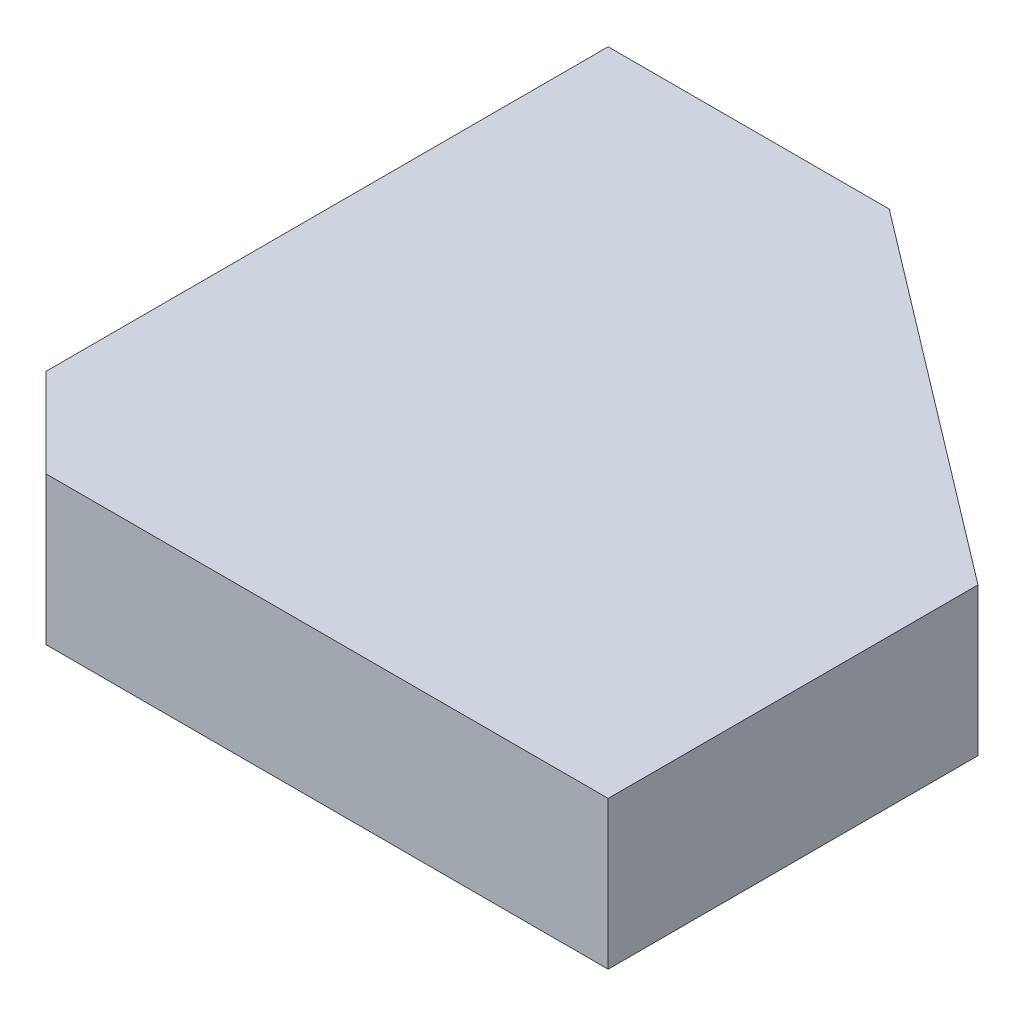
ISO-10303-21;
HEADER;
FILE_DESCRIPTION(('STEP AP214'),'2;1');
FILE_NAME('part.step','',(''),(''),'','','');
FILE_SCHEMA(('AUTOMOTIVE_DESIGN { 1 0 10303 214 1 1 1 1 }'));
ENDSEC;
DATA;
#1=APPLICATION_CONTEXT('core data for automotive mechanical design processes');
#2=APPLICATION_PROTOCOL_DEFINITION('international standard','automotive_design',2000,#1);
#3=PRODUCT_CONTEXT('',#1,'mechanical');
#4=PRODUCT('Part','Part','',(#3));
#5=PRODUCT_RELATED_PRODUCT_CATEGORY('part','',(#4));
#6=PRODUCT_DEFINITION_FORMATION('','',#4);
#7=PRODUCT_DEFINITION_CONTEXT('part definition',#1,'design');
#8=PRODUCT_DEFINITION('design','',#6,#7);
#9=PRODUCT_DEFINITION_SHAPE('','',#8);
#10=(LENGTH_UNIT() NAMED_UNIT(*) SI_UNIT(.MILLI.,.METRE.));
#11=(NAMED_UNIT(*) PLANE_ANGLE_UNIT() SI_UNIT($,.RADIAN.));
#12=(NAMED_UNIT(*) SI_UNIT($,.STERADIAN.) SOLID_ANGLE_UNIT());
#13=UNCERTAINTY_MEASURE_WITH_UNIT(LENGTH_MEASURE(1.E-05),#10,'distance_accuracy_value','');
#14=(GEOMETRIC_REPRESENTATION_CONTEXT(3) GLOBAL_UNCERTAINTY_ASSIGNED_CONTEXT((#13)) GLOBAL_UNIT_ASSIGNED_CONTEXT((#10,
#11,#12)) REPRESENTATION_CONTEXT('',''));
#15=CARTESIAN_POINT('',(0.,0.,0.));
#16=DIRECTION('',(0.,0.,1.));
#17=DIRECTION('',(1.,0.,0.));
#18=AXIS2_PLACEMENT_3D('',#15,#16,#17);
#19=CARTESIAN_POINT('',(0.,5.,0.));
#20=DIRECTION('',(-1.,0.,0.));
#21=DIRECTION('',(0.,0.,1.));
#22=AXIS2_PLACEMENT_3D('',#19,#20,#21);
#23=PLANE('',#22);
#24=DIRECTION('',(0.,0.,-1.));
#25=VECTOR('',#24,1.);
#26=CARTESIAN_POINT('',(0.,-5.,0.));
#27=LINE('',#26,#25);
#28=CARTESIAN_POINT('',(0.,-5.,-6.00000000000004));
#29=VERTEX_POINT('',#28);
#30=CARTESIAN_POINT('',(0.,-5.,-44.));
#31=VERTEX_POINT('',#30);
#32=EDGE_CURVE('E137',#29,#31,#27,.T.);
#33=ORIENTED_EDGE('',*,*,#32,.F.);
#34=DIRECTION('',(0.,1.,0.));
#35=VECTOR('',#34,1.);
#36=CARTESIAN_POINT('',(0.,5.,-6.00000000000004));
#37=LINE('',#36,#35);
#38=CARTESIAN_POINT('',(0.,5.,-6.00000000000003));
#39=VERTEX_POINT('',#38);
#40=EDGE_CURVE('E42',#29,#39,#37,.T.);
#41=ORIENTED_EDGE('',*,*,#40,.T.);
#42=DIRECTION('',(0.,0.,-1.));
#43=VECTOR('',#42,1.);
#44=CARTESIAN_POINT('',(0.,5.,0.));
#45=LINE('',#44,#43);
#46=CARTESIAN_POINT('',(0.,5.,-44.));
#47=VERTEX_POINT('',#46);
#48=EDGE_CURVE('E83',#39,#47,#45,.T.);
#49=ORIENTED_EDGE('',*,*,#48,.T.);
#50=DIRECTION('',(0.,-1.,0.));
#51=VECTOR('',#50,1.);
#52=CARTESIAN_POINT('',(0.,5.,-44.));
#53=LINE('',#52,#51);
#54=EDGE_CURVE('E86',#47,#31,#53,.T.);
#55=ORIENTED_EDGE('',*,*,#54,.T.);
#56=EDGE_LOOP('',(#33,#41,#49,#55));
#57=FACE_BOUND('',#56,.T.);
#58=ADVANCED_FACE('F34',(#57),#23,.T.);
#59=CARTESIAN_POINT('',(0.,5.,0.));
#60=DIRECTION('',(0.,0.,-1.));
#61=DIRECTION('',(-1.,0.,0.));
#62=AXIS2_PLACEMENT_3D('',#59,#60,#61);
#63=PLANE('',#62);
#64=DIRECTION('',(1.,0.,0.));
#65=VECTOR('',#64,1.);
#66=CARTESIAN_POINT('',(0.,5.,0.));
#67=LINE('',#66,#65);
#68=CARTESIAN_POINT('',(6.00000000000011,5.,0.));
#69=VERTEX_POINT('',#68);
#70=CARTESIAN_POINT('',(44.,5.,0.));
#71=VERTEX_POINT('',#70);
#72=EDGE_CURVE('E106',#69,#71,#67,.T.);
#73=ORIENTED_EDGE('',*,*,#72,.F.);
#74=DIRECTION('',(0.,-1.,0.));
#75=VECTOR('',#74,1.);
#76=CARTESIAN_POINT('',(6.0000000000001,-5.,0.));
#77=LINE('',#76,#75);
#78=CARTESIAN_POINT('',(6.0000000000001,-5.,0.));
#79=VERTEX_POINT('',#78);
#80=EDGE_CURVE('E114',#69,#79,#77,.T.);
#81=ORIENTED_EDGE('',*,*,#80,.T.);
#82=DIRECTION('',(1.,0.,0.));
#83=VECTOR('',#82,1.);
#84=CARTESIAN_POINT('',(0.,-5.,0.));
#85=LINE('',#84,#83);
#86=CARTESIAN_POINT('',(44.,-5.,0.));
#87=VERTEX_POINT('',#86);
#88=EDGE_CURVE('E92',#79,#87,#85,.T.);
#89=ORIENTED_EDGE('',*,*,#88,.T.);
#90=DIRECTION('',(0.,-1.,0.));
#91=VECTOR('',#90,1.);
#92=CARTESIAN_POINT('',(44.,5.,0.));
#93=LINE('',#92,#91);
#94=EDGE_CURVE('E117',#71,#87,#93,.T.);
#95=ORIENTED_EDGE('',*,*,#94,.F.);
#96=EDGE_LOOP('',(#73,#81,#89,#95));
#97=FACE_BOUND('',#96,.T.);
#98=ADVANCED_FACE('F145',(#97),#63,.F.);
#99=CARTESIAN_POINT('',(44.,5.,-25.));
#100=DIRECTION('',(1.,0.,0.));
#101=DIRECTION('',(0.,0.,-1.));
#102=AXIS2_PLACEMENT_3D('',#99,#100,#101);
#103=PLANE('',#102);
#104=DIRECTION('',(0.,0.,1.));
#105=VECTOR('',#104,1.);
#106=CARTESIAN_POINT('',(44.,-5.,-25.));
#107=LINE('',#106,#105);
#108=CARTESIAN_POINT('',(44.,-5.,-25.));
#109=VERTEX_POINT('',#108);
#110=EDGE_CURVE('E131',#109,#87,#107,.T.);
#111=ORIENTED_EDGE('',*,*,#110,.F.);
#112=DIRECTION('',(0.,-1.,0.));
#113=VECTOR('',#112,1.);
#114=CARTESIAN_POINT('',(44.,5.,-25.));
#115=LINE('',#114,#113);
#116=CARTESIAN_POINT('',(44.,5.,-25.));
#117=VERTEX_POINT('',#116);
#118=EDGE_CURVE('E108',#117,#109,#115,.T.);
#119=ORIENTED_EDGE('',*,*,#118,.F.);
#120=DIRECTION('',(0.,0.,1.));
#121=VECTOR('',#120,1.);
#122=CARTESIAN_POINT('',(44.,5.,-25.));
#123=LINE('',#122,#121);
#124=EDGE_CURVE('E110',#117,#71,#123,.T.);
#125=ORIENTED_EDGE('',*,*,#124,.T.);
#126=ORIENTED_EDGE('',*,*,#94,.T.);
#127=EDGE_LOOP('',(#111,#119,#125,#126));
#128=FACE_BOUND('',#127,.T.);
#129=ADVANCED_FACE('F146',(#128),#103,.T.);
#130=CARTESIAN_POINT('',(19.,5.,-44.));
#131=DIRECTION('',(0.605083267533558,0.,-0.796162194123103));
#132=DIRECTION('',(-0.796162194123103,0.,-0.605083267533558));
#133=AXIS2_PLACEMENT_3D('',#130,#131,#132);
#134=PLANE('',#133);
#135=DIRECTION('',(0.796162194123103,0.,0.605083267533558));
#136=VECTOR('',#135,1.);
#137=CARTESIAN_POINT('',(19.,-5.,-44.));
#138=LINE('',#137,#136);
#139=CARTESIAN_POINT('',(19.,-5.,-44.));
#140=VERTEX_POINT('',#139);
#141=EDGE_CURVE('E133',#140,#109,#138,.T.);
#142=ORIENTED_EDGE('',*,*,#141,.F.);
#143=DIRECTION('',(0.,-1.,0.));
#144=VECTOR('',#143,1.);
#145=CARTESIAN_POINT('',(19.,5.,-44.));
#146=LINE('',#145,#144);
#147=CARTESIAN_POINT('',(19.,5.,-44.));
#148=VERTEX_POINT('',#147);
#149=EDGE_CURVE('E105',#148,#140,#146,.T.);
#150=ORIENTED_EDGE('',*,*,#149,.F.);
#151=DIRECTION('',(0.796162194123103,0.,0.605083267533558));
#152=VECTOR('',#151,1.);
#153=CARTESIAN_POINT('',(19.,5.,-44.));
#154=LINE('',#153,#152);
#155=EDGE_CURVE('E99',#148,#117,#154,.T.);
#156=ORIENTED_EDGE('',*,*,#155,.T.);
#157=ORIENTED_EDGE('',*,*,#118,.T.);
#158=EDGE_LOOP('',(#142,#150,#156,#157));
#159=FACE_BOUND('',#158,.T.);
#160=ADVANCED_FACE('F142',(#159),#134,.T.);
#161=CARTESIAN_POINT('',(19.,5.,-44.));
#162=DIRECTION('',(0.,0.,1.));
#163=DIRECTION('',(1.,0.,0.));
#164=AXIS2_PLACEMENT_3D('',#161,#162,#163);
#165=PLANE('',#164);
#166=DIRECTION('',(-1.,0.,0.));
#167=VECTOR('',#166,1.);
#168=CARTESIAN_POINT('',(19.,-5.,-44.));
#169=LINE('',#168,#167);
#170=EDGE_CURVE('E104',#140,#31,#169,.T.);
#171=ORIENTED_EDGE('',*,*,#170,.T.);
#172=ORIENTED_EDGE('',*,*,#54,.F.);
#173=DIRECTION('',(-1.,0.,0.));
#174=VECTOR('',#173,1.);
#175=CARTESIAN_POINT('',(19.,5.,-44.));
#176=LINE('',#175,#174);
#177=EDGE_CURVE('E91',#148,#47,#176,.T.);
#178=ORIENTED_EDGE('',*,*,#177,.F.);
#179=ORIENTED_EDGE('',*,*,#149,.T.);
#180=EDGE_LOOP('',(#171,#172,#178,#179));
#181=FACE_BOUND('',#180,.T.);
#182=ADVANCED_FACE('F102',(#181),#165,.F.);
#183=CARTESIAN_POINT('',(0.,5.,-44.));
#184=DIRECTION('',(0.,1.,0.));
#185=DIRECTION('',(0.,0.,1.));
#186=AXIS2_PLACEMENT_3D('',#183,#184,#185);
#187=PLANE('',#186);
#188=ORIENTED_EDGE('',*,*,#48,.F.);
#189=DIRECTION('',(0.707106781186551,0.,0.707106781186544));
#190=VECTOR('',#189,1.);
#191=CARTESIAN_POINT('',(-19.,5.,-24.9999999999998));
#192=LINE('',#191,#190);
#193=EDGE_CURVE('E11',#39,#69,#192,.T.);
#194=ORIENTED_EDGE('',*,*,#193,.T.);
#195=ORIENTED_EDGE('',*,*,#72,.T.);
#196=ORIENTED_EDGE('',*,*,#124,.F.);
#197=ORIENTED_EDGE('',*,*,#155,.F.);
#198=ORIENTED_EDGE('',*,*,#177,.T.);
#199=EDGE_LOOP('',(#188,#194,#195,#196,#197,#198));
#200=FACE_BOUND('',#199,.T.);
#201=ADVANCED_FACE('F96',(#200),#187,.T.);
#202=CARTESIAN_POINT('',(0.,-5.,-44.));
#203=DIRECTION('',(0.,1.,0.));
#204=DIRECTION('',(0.,0.,1.));
#205=AXIS2_PLACEMENT_3D('',#202,#203,#204);
#206=PLANE('',#205);
#207=ORIENTED_EDGE('',*,*,#88,.F.);
#208=DIRECTION('',(-0.707106781186551,0.,-0.707106781186544));
#209=VECTOR('',#208,1.);
#210=CARTESIAN_POINT('',(6.0000000000001,-5.,0.));
#211=LINE('',#210,#209);
#212=EDGE_CURVE('E56',#79,#29,#211,.T.);
#213=ORIENTED_EDGE('',*,*,#212,.T.);
#214=ORIENTED_EDGE('',*,*,#32,.T.);
#215=ORIENTED_EDGE('',*,*,#170,.F.);
#216=ORIENTED_EDGE('',*,*,#141,.T.);
#217=ORIENTED_EDGE('',*,*,#110,.T.);
#218=EDGE_LOOP('',(#207,#213,#214,#215,#216,#217));
#219=FACE_BOUND('',#218,.T.);
#220=ADVANCED_FACE('F143',(#219),#206,.F.);
#221=CARTESIAN_POINT('',(6.0000000000001,5.,0.));
#222=DIRECTION('',(-0.707106781186544,0.,0.707106781186551));
#223=DIRECTION('',(0.707106781186551,0.,0.707106781186544));
#224=AXIS2_PLACEMENT_3D('',#221,#222,#223);
#225=PLANE('',#224);
#226=ORIENTED_EDGE('',*,*,#193,.F.);
#227=ORIENTED_EDGE('',*,*,#40,.F.);
#228=ORIENTED_EDGE('',*,*,#212,.F.);
#229=ORIENTED_EDGE('',*,*,#80,.F.);
#230=EDGE_LOOP('',(#226,#227,#228,#229));
#231=FACE_BOUND('',#230,.T.);
#232=ADVANCED_FACE('F36',(#231),#225,.T.);
#233=CLOSED_SHELL('',(#58,#98,#129,#160,#182,#201,#220,#232));
#234=MANIFOLD_SOLID_BREP('B2',#233);
#235=ADVANCED_BREP_SHAPE_REPRESENTATION('',(#18,#234),#14);
#236=SHAPE_DEFINITION_REPRESENTATION(#9,#235);
ENDSEC;
END-ISO-10303-21;
